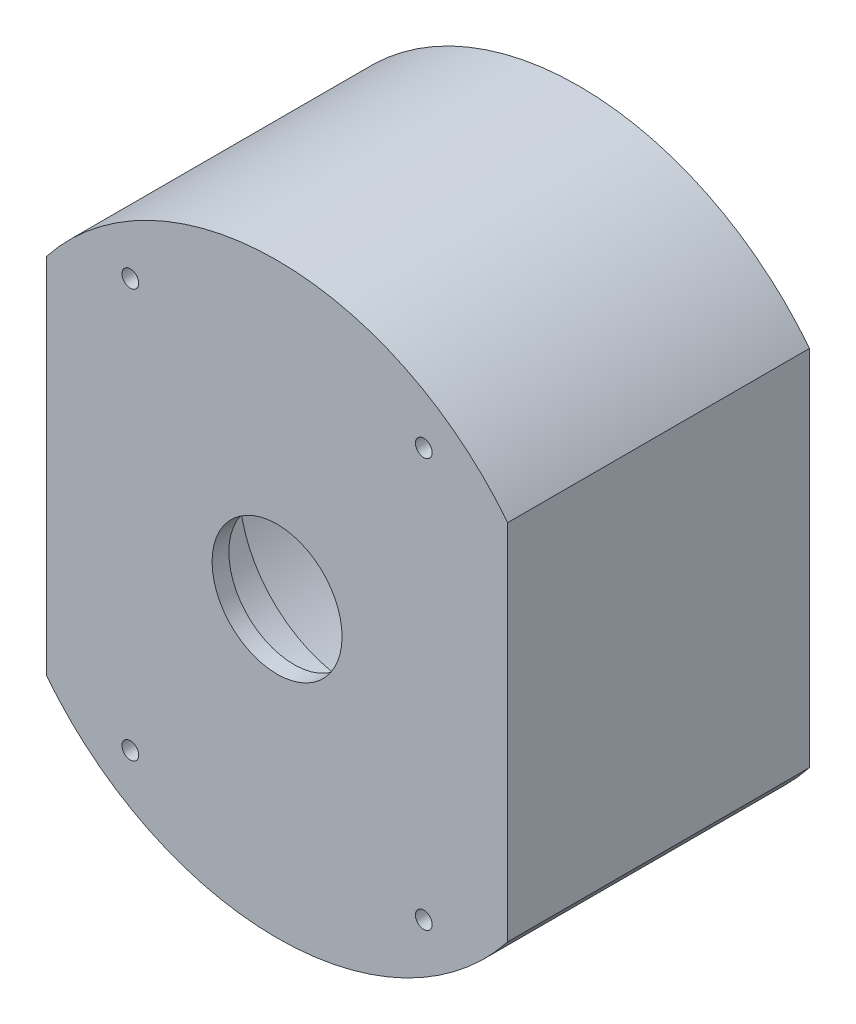
ISO-10303-21;
HEADER;
FILE_DESCRIPTION(('STEP AP214'),'2;1');
FILE_NAME('part.step','',(''),(''),'','','');
FILE_SCHEMA(('AUTOMOTIVE_DESIGN { 1 0 10303 214 1 1 1 1 }'));
ENDSEC;
DATA;
#1=APPLICATION_CONTEXT('core data for automotive mechanical design processes');
#2=APPLICATION_PROTOCOL_DEFINITION('international standard','automotive_design',2000,#1);
#3=PRODUCT_CONTEXT('',#1,'mechanical');
#4=PRODUCT('Part','Part','',(#3));
#5=PRODUCT_RELATED_PRODUCT_CATEGORY('part','',(#4));
#6=PRODUCT_DEFINITION_FORMATION('','',#4);
#7=PRODUCT_DEFINITION_CONTEXT('part definition',#1,'design');
#8=PRODUCT_DEFINITION('design','',#6,#7);
#9=PRODUCT_DEFINITION_SHAPE('','',#8);
#10=(LENGTH_UNIT() NAMED_UNIT(*) SI_UNIT(.MILLI.,.METRE.));
#11=(NAMED_UNIT(*) PLANE_ANGLE_UNIT() SI_UNIT($,.RADIAN.));
#12=(NAMED_UNIT(*) SI_UNIT($,.STERADIAN.) SOLID_ANGLE_UNIT());
#13=UNCERTAINTY_MEASURE_WITH_UNIT(LENGTH_MEASURE(1.E-05),#10,'distance_accuracy_value','');
#14=(GEOMETRIC_REPRESENTATION_CONTEXT(3) GLOBAL_UNCERTAINTY_ASSIGNED_CONTEXT((#13)) GLOBAL_UNIT_ASSIGNED_CONTEXT((#10,
#11,#12)) REPRESENTATION_CONTEXT('',''));
#15=CARTESIAN_POINT('',(0.,0.,0.));
#16=DIRECTION('',(0.,0.,1.));
#17=DIRECTION('',(1.,0.,0.));
#18=AXIS2_PLACEMENT_3D('',#15,#16,#17);
#19=CARTESIAN_POINT('',(0.,0.,72.));
#20=DIRECTION('',(0.,0.,-1.));
#21=DIRECTION('',(-1.,0.,0.));
#22=AXIS2_PLACEMENT_3D('',#19,#20,#21);
#23=CYLINDRICAL_SURFACE('',#22,15.5);
#24=CARTESIAN_POINT('',(0.,0.,72.));
#25=DIRECTION('',(0.,0.,1.));
#26=DIRECTION('',(1.,0.,0.));
#27=AXIS2_PLACEMENT_3D('',#24,#25,#26);
#28=CIRCLE('',#27,15.5);
#29=CARTESIAN_POINT('',(15.5,0.,72.));
#30=VERTEX_POINT('',#29);
#31=EDGE_CURVE('E96',#30,#30,#28,.T.);
#32=ORIENTED_EDGE('',*,*,#31,.T.);
#33=EDGE_LOOP('',(#32));
#34=FACE_BOUND('',#33,.T.);
#35=CARTESIAN_POINT('',(0.,0.,68.));
#36=DIRECTION('',(0.,0.,-1.));
#37=DIRECTION('',(-1.,0.,0.));
#38=AXIS2_PLACEMENT_3D('',#35,#36,#37);
#39=CIRCLE('',#38,15.5);
#40=CARTESIAN_POINT('',(-15.5,0.,68.));
#41=VERTEX_POINT('',#40);
#42=EDGE_CURVE('E37',#41,#41,#39,.T.);
#43=ORIENTED_EDGE('',*,*,#42,.T.);
#44=EDGE_LOOP('',(#43));
#45=FACE_BOUND('',#44,.T.);
#46=ADVANCED_FACE('F33',(#34,#45),#23,.F.);
#47=CARTESIAN_POINT('',(0.,0.,53.5));
#48=DIRECTION('',(0.,0.,-1.));
#49=DIRECTION('',(-1.,0.,0.));
#50=AXIS2_PLACEMENT_3D('',#47,#48,#49);
#51=CYLINDRICAL_SURFACE('',#50,50.25);
#52=CARTESIAN_POINT('',(0.,0.,0.));
#53=DIRECTION('',(0.,0.,1.));
#54=DIRECTION('',(1.,0.,0.));
#55=AXIS2_PLACEMENT_3D('',#52,#53,#54);
#56=CIRCLE('',#55,50.25);
#57=CARTESIAN_POINT('',(50.25,0.,0.));
#58=VERTEX_POINT('',#57);
#59=EDGE_CURVE('E118',#58,#58,#56,.T.);
#60=ORIENTED_EDGE('',*,*,#59,.F.);
#61=EDGE_LOOP('',(#60));
#62=FACE_BOUND('',#61,.T.);
#63=CARTESIAN_POINT('',(0.,0.,22.5));
#64=DIRECTION('',(0.,0.,1.));
#65=DIRECTION('',(1.,0.,0.));
#66=AXIS2_PLACEMENT_3D('',#63,#64,#65);
#67=CIRCLE('',#66,50.25);
#68=CARTESIAN_POINT('',(50.25,0.,22.5));
#69=VERTEX_POINT('',#68);
#70=EDGE_CURVE('E117',#69,#69,#67,.T.);
#71=ORIENTED_EDGE('',*,*,#70,.T.);
#72=EDGE_LOOP('',(#71));
#73=FACE_BOUND('',#72,.T.);
#74=ADVANCED_FACE('F133',(#62,#73),#51,.F.);
#75=CARTESIAN_POINT('',(0.,-5.89805981832114E-13,0.));
#76=DIRECTION('',(0.,0.,1.));
#77=DIRECTION('',(1.,0.,0.));
#78=AXIS2_PLACEMENT_3D('',#75,#76,#77);
#79=PLANE('',#78);
#80=CARTESIAN_POINT('',(-35.,48.7339717240448,0.));
#81=DIRECTION('',(0.,0.,1.));
#82=DIRECTION('',(1.,0.,0.));
#83=AXIS2_PLACEMENT_3D('',#80,#81,#82);
#84=CIRCLE('',#83,2.);
#85=CARTESIAN_POINT('',(-33.,48.7339717240448,0.));
#86=VERTEX_POINT('',#85);
#87=EDGE_CURVE('E193',#86,#86,#84,.T.);
#88=ORIENTED_EDGE('',*,*,#87,.T.);
#89=EDGE_LOOP('',(#88));
#90=FACE_BOUND('',#89,.T.);
#91=CARTESIAN_POINT('',(35.,48.7339717240448,0.));
#92=DIRECTION('',(0.,0.,1.));
#93=DIRECTION('',(1.,0.,0.));
#94=AXIS2_PLACEMENT_3D('',#91,#92,#93);
#95=CIRCLE('',#94,2.);
#96=CARTESIAN_POINT('',(37.,48.7339717240448,0.));
#97=VERTEX_POINT('',#96);
#98=EDGE_CURVE('E200',#97,#97,#95,.T.);
#99=ORIENTED_EDGE('',*,*,#98,.T.);
#100=EDGE_LOOP('',(#99));
#101=FACE_BOUND('',#100,.T.);
#102=CARTESIAN_POINT('',(35.,-48.7339717240448,0.));
#103=DIRECTION('',(0.,0.,1.));
#104=DIRECTION('',(1.,0.,0.));
#105=AXIS2_PLACEMENT_3D('',#102,#103,#104);
#106=CIRCLE('',#105,2.);
#107=CARTESIAN_POINT('',(37.,-48.7339717240448,0.));
#108=VERTEX_POINT('',#107);
#109=EDGE_CURVE('E206',#108,#108,#106,.T.);
#110=ORIENTED_EDGE('',*,*,#109,.T.);
#111=EDGE_LOOP('',(#110));
#112=FACE_BOUND('',#111,.T.);
#113=CARTESIAN_POINT('',(-35.,-48.7339717240448,0.));
#114=DIRECTION('',(0.,0.,1.));
#115=DIRECTION('',(1.,0.,0.));
#116=AXIS2_PLACEMENT_3D('',#113,#114,#115);
#117=CIRCLE('',#116,2.);
#118=CARTESIAN_POINT('',(-33.,-48.7339717240448,0.));
#119=VERTEX_POINT('',#118);
#120=EDGE_CURVE('E99',#119,#119,#117,.T.);
#121=ORIENTED_EDGE('',*,*,#120,.T.);
#122=EDGE_LOOP('',(#121));
#123=FACE_BOUND('',#122,.T.);
#124=CARTESIAN_POINT('',(0.,-5.89805981832114E-13,0.));
#125=DIRECTION('',(0.,0.,1.));
#126=DIRECTION('',(1.,0.,0.));
#127=AXIS2_PLACEMENT_3D('',#124,#125,#126);
#128=CIRCLE('',#127,70.0000000000004);
#129=CARTESIAN_POINT('',(55.,43.3012701892219,0.));
#130=VERTEX_POINT('',#129);
#131=CARTESIAN_POINT('',(-55.,43.3012701892219,0.));
#132=VERTEX_POINT('',#131);
#133=EDGE_CURVE('E81',#130,#132,#128,.T.);
#134=ORIENTED_EDGE('',*,*,#133,.F.);
#135=DIRECTION('',(0.,1.,0.));
#136=VECTOR('',#135,1.);
#137=CARTESIAN_POINT('',(55.,43.3012701892219,0.));
#138=LINE('',#137,#136);
#139=CARTESIAN_POINT('',(55.,-43.3012701892219,0.));
#140=VERTEX_POINT('',#139);
#141=EDGE_CURVE('E50',#140,#130,#138,.T.);
#142=ORIENTED_EDGE('',*,*,#141,.F.);
#143=CARTESIAN_POINT('',(0.,4.85722573273506E-13,0.));
#144=DIRECTION('',(0.,0.,1.));
#145=DIRECTION('',(-1.,0.,0.));
#146=AXIS2_PLACEMENT_3D('',#143,#144,#145);
#147=CIRCLE('',#146,70.0000000000003);
#148=CARTESIAN_POINT('',(-55.,-43.3012701892219,0.));
#149=VERTEX_POINT('',#148);
#150=EDGE_CURVE('E58',#149,#140,#147,.T.);
#151=ORIENTED_EDGE('',*,*,#150,.F.);
#152=DIRECTION('',(0.,-1.,0.));
#153=VECTOR('',#152,1.);
#154=CARTESIAN_POINT('',(-55.,43.3012701892219,0.));
#155=LINE('',#154,#153);
#156=EDGE_CURVE('E122',#132,#149,#155,.T.);
#157=ORIENTED_EDGE('',*,*,#156,.F.);
#158=EDGE_LOOP('',(#134,#142,#151,#157));
#159=FACE_BOUND('',#158,.T.);
#160=ORIENTED_EDGE('',*,*,#59,.T.);
#161=EDGE_LOOP('',(#160));
#162=FACE_BOUND('',#161,.T.);
#163=ADVANCED_FACE('F165',(#90,#101,#112,#123,#159,#162),#79,.F.);
#164=CARTESIAN_POINT('',(0.,-5.89805981832114E-13,53.5));
#165=DIRECTION('',(0.,0.,-1.));
#166=DIRECTION('',(-1.,0.,0.));
#167=AXIS2_PLACEMENT_3D('',#164,#165,#166);
#168=CYLINDRICAL_SURFACE('',#167,70.0000000000004);
#169=ORIENTED_EDGE('',*,*,#133,.T.);
#170=DIRECTION('',(0.,0.,-1.));
#171=VECTOR('',#170,1.);
#172=CARTESIAN_POINT('',(-55.,43.3012701892219,53.5));
#173=LINE('',#172,#171);
#174=CARTESIAN_POINT('',(-55.,43.3012701892219,72.));
#175=VERTEX_POINT('',#174);
#176=EDGE_CURVE('E11',#175,#132,#173,.T.);
#177=ORIENTED_EDGE('',*,*,#176,.F.);
#178=CARTESIAN_POINT('',(0.,-7.84095011141517E-13,72.));
#179=DIRECTION('',(0.,0.,1.));
#180=DIRECTION('',(-1.,0.,0.));
#181=AXIS2_PLACEMENT_3D('',#178,#179,#180);
#182=CIRCLE('',#181,70.0000000000005);
#183=CARTESIAN_POINT('',(55.,43.301270189222,72.));
#184=VERTEX_POINT('',#183);
#185=EDGE_CURVE('E79',#184,#175,#182,.T.);
#186=ORIENTED_EDGE('',*,*,#185,.F.);
#187=DIRECTION('',(0.,0.,-1.));
#188=VECTOR('',#187,1.);
#189=CARTESIAN_POINT('',(55.,43.3012701892219,53.5));
#190=LINE('',#189,#188);
#191=EDGE_CURVE('E126',#184,#130,#190,.T.);
#192=ORIENTED_EDGE('',*,*,#191,.T.);
#193=EDGE_LOOP('',(#169,#177,#186,#192));
#194=FACE_BOUND('',#193,.T.);
#195=ADVANCED_FACE('F35',(#194),#168,.T.);
#196=CARTESIAN_POINT('',(-55.,43.3012701892219,53.5));
#197=DIRECTION('',(1.,0.,0.));
#198=DIRECTION('',(0.,0.,-1.));
#199=AXIS2_PLACEMENT_3D('',#196,#197,#198);
#200=PLANE('',#199);
#201=ORIENTED_EDGE('',*,*,#156,.T.);
#202=DIRECTION('',(0.,0.,-1.));
#203=VECTOR('',#202,1.);
#204=CARTESIAN_POINT('',(-55.,-43.3012701892219,53.5));
#205=LINE('',#204,#203);
#206=CARTESIAN_POINT('',(-55.,-43.3012701892219,72.));
#207=VERTEX_POINT('',#206);
#208=EDGE_CURVE('E42',#207,#149,#205,.T.);
#209=ORIENTED_EDGE('',*,*,#208,.F.);
#210=DIRECTION('',(0.,-1.,0.));
#211=VECTOR('',#210,1.);
#212=CARTESIAN_POINT('',(-55.,43.3012701892219,72.));
#213=LINE('',#212,#211);
#214=EDGE_CURVE('E84',#175,#207,#213,.T.);
#215=ORIENTED_EDGE('',*,*,#214,.F.);
#216=ORIENTED_EDGE('',*,*,#176,.T.);
#217=EDGE_LOOP('',(#201,#209,#215,#216));
#218=FACE_BOUND('',#217,.T.);
#219=ADVANCED_FACE('F85',(#218),#200,.F.);
#220=CARTESIAN_POINT('',(0.,4.85722573273506E-13,53.5));
#221=DIRECTION('',(0.,0.,-1.));
#222=DIRECTION('',(-1.,0.,0.));
#223=AXIS2_PLACEMENT_3D('',#220,#221,#222);
#224=CYLINDRICAL_SURFACE('',#223,70.0000000000003);
#225=ORIENTED_EDGE('',*,*,#150,.T.);
#226=DIRECTION('',(0.,0.,-1.));
#227=VECTOR('',#226,1.);
#228=CARTESIAN_POINT('',(55.,-43.3012701892219,53.5));
#229=LINE('',#228,#227);
#230=CARTESIAN_POINT('',(55.,-43.3012701892219,72.));
#231=VERTEX_POINT('',#230);
#232=EDGE_CURVE('E128',#231,#140,#229,.T.);
#233=ORIENTED_EDGE('',*,*,#232,.F.);
#234=CARTESIAN_POINT('',(0.,7.97972798949331E-13,72.));
#235=DIRECTION('',(0.,0.,1.));
#236=DIRECTION('',(1.,0.,0.));
#237=AXIS2_PLACEMENT_3D('',#234,#235,#236);
#238=CIRCLE('',#237,70.0000000000005);
#239=EDGE_CURVE('E89',#207,#231,#238,.T.);
#240=ORIENTED_EDGE('',*,*,#239,.F.);
#241=ORIENTED_EDGE('',*,*,#208,.T.);
#242=EDGE_LOOP('',(#225,#233,#240,#241));
#243=FACE_BOUND('',#242,.T.);
#244=ADVANCED_FACE('F233',(#243),#224,.T.);
#245=CARTESIAN_POINT('',(55.,43.3012701892219,53.5));
#246=DIRECTION('',(-1.,0.,0.));
#247=DIRECTION('',(0.,0.,1.));
#248=AXIS2_PLACEMENT_3D('',#245,#246,#247);
#249=PLANE('',#248);
#250=ORIENTED_EDGE('',*,*,#141,.T.);
#251=ORIENTED_EDGE('',*,*,#191,.F.);
#252=DIRECTION('',(0.,1.,0.));
#253=VECTOR('',#252,1.);
#254=CARTESIAN_POINT('',(55.,43.301270189222,72.));
#255=LINE('',#254,#253);
#256=EDGE_CURVE('E95',#231,#184,#255,.T.);
#257=ORIENTED_EDGE('',*,*,#256,.F.);
#258=ORIENTED_EDGE('',*,*,#232,.T.);
#259=EDGE_LOOP('',(#250,#251,#257,#258));
#260=FACE_BOUND('',#259,.T.);
#261=ADVANCED_FACE('F145',(#260),#249,.F.);
#262=CARTESIAN_POINT('',(0.,0.,22.5));
#263=DIRECTION('',(0.,0.,1.));
#264=DIRECTION('',(1.,0.,0.));
#265=AXIS2_PLACEMENT_3D('',#262,#263,#264);
#266=CYLINDRICAL_SURFACE('',#265,50.5);
#267=CARTESIAN_POINT('',(0.,0.,22.5));
#268=DIRECTION('',(0.,0.,1.));
#269=DIRECTION('',(1.,0.,0.));
#270=AXIS2_PLACEMENT_3D('',#267,#268,#269);
#271=CIRCLE('',#270,50.5);
#272=CARTESIAN_POINT('',(50.5,0.,22.5));
#273=VERTEX_POINT('',#272);
#274=EDGE_CURVE('E114',#273,#273,#271,.T.);
#275=ORIENTED_EDGE('',*,*,#274,.F.);
#276=EDGE_LOOP('',(#275));
#277=FACE_BOUND('',#276,.T.);
#278=CARTESIAN_POINT('',(0.,0.,53.5));
#279=DIRECTION('',(0.,0.,1.));
#280=DIRECTION('',(1.,0.,0.));
#281=AXIS2_PLACEMENT_3D('',#278,#279,#280);
#282=CIRCLE('',#281,50.5);
#283=CARTESIAN_POINT('',(50.5,0.,53.5));
#284=VERTEX_POINT('',#283);
#285=EDGE_CURVE('E111',#284,#284,#282,.F.);
#286=ORIENTED_EDGE('',*,*,#285,.F.);
#287=EDGE_LOOP('',(#286));
#288=FACE_BOUND('',#287,.T.);
#289=ADVANCED_FACE('F139',(#277,#288),#266,.F.);
#290=CARTESIAN_POINT('',(0.,0.,22.5));
#291=DIRECTION('',(0.,0.,1.));
#292=DIRECTION('',(1.,0.,0.));
#293=AXIS2_PLACEMENT_3D('',#290,#291,#292);
#294=PLANE('',#293);
#295=ORIENTED_EDGE('',*,*,#70,.F.);
#296=EDGE_LOOP('',(#295));
#297=FACE_BOUND('',#296,.T.);
#298=ORIENTED_EDGE('',*,*,#274,.T.);
#299=EDGE_LOOP('',(#298));
#300=FACE_BOUND('',#299,.T.);
#301=ADVANCED_FACE('F135',(#297,#300),#294,.T.);
#302=CARTESIAN_POINT('',(0.,6.80011602582908E-13,53.5));
#303=DIRECTION('',(0.,0.,1.));
#304=DIRECTION('',(1.,0.,0.));
#305=AXIS2_PLACEMENT_3D('',#302,#303,#304);
#306=PLANE('',#305);
#307=CARTESIAN_POINT('',(0.,0.,53.5));
#308=DIRECTION('',(0.,0.,1.));
#309=DIRECTION('',(1.,0.,0.));
#310=AXIS2_PLACEMENT_3D('',#307,#308,#309);
#311=CIRCLE('',#310,27.5);
#312=CARTESIAN_POINT('',(27.5,0.,53.5));
#313=VERTEX_POINT('',#312);
#314=EDGE_CURVE('E108',#313,#313,#311,.T.);
#315=ORIENTED_EDGE('',*,*,#314,.T.);
#316=EDGE_LOOP('',(#315));
#317=FACE_BOUND('',#316,.T.);
#318=ORIENTED_EDGE('',*,*,#285,.T.);
#319=EDGE_LOOP('',(#318));
#320=FACE_BOUND('',#319,.T.);
#321=ADVANCED_FACE('F138',(#317,#320),#306,.F.);
#322=CARTESIAN_POINT('',(0.,0.,67.));
#323=DIRECTION('',(0.,0.,-1.));
#324=DIRECTION('',(-1.,0.,0.));
#325=AXIS2_PLACEMENT_3D('',#322,#323,#324);
#326=CYLINDRICAL_SURFACE('',#325,27.5);
#327=CARTESIAN_POINT('',(0.,0.,67.));
#328=DIRECTION('',(0.,0.,-1.));
#329=DIRECTION('',(-1.,0.,0.));
#330=AXIS2_PLACEMENT_3D('',#327,#328,#329);
#331=CIRCLE('',#330,27.5);
#332=CARTESIAN_POINT('',(-27.5,0.,67.));
#333=VERTEX_POINT('',#332);
#334=EDGE_CURVE('E105',#333,#333,#331,.T.);
#335=ORIENTED_EDGE('',*,*,#334,.F.);
#336=EDGE_LOOP('',(#335));
#337=FACE_BOUND('',#336,.T.);
#338=ORIENTED_EDGE('',*,*,#314,.F.);
#339=EDGE_LOOP('',(#338));
#340=FACE_BOUND('',#339,.T.);
#341=ADVANCED_FACE('F150',(#337,#340),#326,.F.);
#342=CARTESIAN_POINT('',(0.,-7.84095011141517E-13,67.));
#343=DIRECTION('',(0.,0.,-1.));
#344=DIRECTION('',(-1.,0.,0.));
#345=AXIS2_PLACEMENT_3D('',#342,#343,#344);
#346=PLANE('',#345);
#347=CARTESIAN_POINT('',(0.,0.,67.));
#348=DIRECTION('',(0.,0.,-1.));
#349=DIRECTION('',(-1.,0.,0.));
#350=AXIS2_PLACEMENT_3D('',#347,#348,#349);
#351=CIRCLE('',#350,22.5);
#352=CARTESIAN_POINT('',(-22.5,0.,67.));
#353=VERTEX_POINT('',#352);
#354=EDGE_CURVE('E183',#353,#353,#351,.T.);
#355=ORIENTED_EDGE('',*,*,#354,.F.);
#356=EDGE_LOOP('',(#355));
#357=FACE_BOUND('',#356,.T.);
#358=ORIENTED_EDGE('',*,*,#334,.T.);
#359=EDGE_LOOP('',(#358));
#360=FACE_BOUND('',#359,.T.);
#361=ADVANCED_FACE('F156',(#357,#360),#346,.T.);
#362=CARTESIAN_POINT('',(0.,-7.84095011141517E-13,72.));
#363=DIRECTION('',(0.,0.,-1.));
#364=DIRECTION('',(-1.,0.,0.));
#365=AXIS2_PLACEMENT_3D('',#362,#363,#364);
#366=PLANE('',#365);
#367=CARTESIAN_POINT('',(-35.,48.7339717240448,72.));
#368=DIRECTION('',(0.,0.,1.));
#369=DIRECTION('',(1.,0.,0.));
#370=AXIS2_PLACEMENT_3D('',#367,#368,#369);
#371=CIRCLE('',#370,2.);
#372=CARTESIAN_POINT('',(-33.,48.7339717240448,72.));
#373=VERTEX_POINT('',#372);
#374=EDGE_CURVE('E197',#373,#373,#371,.T.);
#375=ORIENTED_EDGE('',*,*,#374,.F.);
#376=EDGE_LOOP('',(#375));
#377=FACE_BOUND('',#376,.T.);
#378=CARTESIAN_POINT('',(35.,48.7339717240448,72.));
#379=DIRECTION('',(0.,0.,1.));
#380=DIRECTION('',(1.,0.,0.));
#381=AXIS2_PLACEMENT_3D('',#378,#379,#380);
#382=CIRCLE('',#381,2.);
#383=CARTESIAN_POINT('',(37.,48.7339717240448,72.));
#384=VERTEX_POINT('',#383);
#385=EDGE_CURVE('E203',#384,#384,#382,.T.);
#386=ORIENTED_EDGE('',*,*,#385,.F.);
#387=EDGE_LOOP('',(#386));
#388=FACE_BOUND('',#387,.T.);
#389=CARTESIAN_POINT('',(35.,-48.7339717240448,72.));
#390=DIRECTION('',(0.,0.,1.));
#391=DIRECTION('',(1.,0.,0.));
#392=AXIS2_PLACEMENT_3D('',#389,#390,#391);
#393=CIRCLE('',#392,2.);
#394=CARTESIAN_POINT('',(37.,-48.7339717240448,72.));
#395=VERTEX_POINT('',#394);
#396=EDGE_CURVE('E209',#395,#395,#393,.T.);
#397=ORIENTED_EDGE('',*,*,#396,.F.);
#398=EDGE_LOOP('',(#397));
#399=FACE_BOUND('',#398,.T.);
#400=CARTESIAN_POINT('',(-35.,-48.7339717240448,72.));
#401=DIRECTION('',(0.,0.,1.));
#402=DIRECTION('',(1.,0.,0.));
#403=AXIS2_PLACEMENT_3D('',#400,#401,#402);
#404=CIRCLE('',#403,2.);
#405=CARTESIAN_POINT('',(-33.,-48.7339717240448,72.));
#406=VERTEX_POINT('',#405);
#407=EDGE_CURVE('E196',#406,#406,#404,.T.);
#408=ORIENTED_EDGE('',*,*,#407,.F.);
#409=EDGE_LOOP('',(#408));
#410=FACE_BOUND('',#409,.T.);
#411=ORIENTED_EDGE('',*,*,#185,.T.);
#412=ORIENTED_EDGE('',*,*,#214,.T.);
#413=ORIENTED_EDGE('',*,*,#239,.T.);
#414=ORIENTED_EDGE('',*,*,#256,.T.);
#415=EDGE_LOOP('',(#411,#412,#413,#414));
#416=FACE_BOUND('',#415,.T.);
#417=ORIENTED_EDGE('',*,*,#31,.F.);
#418=EDGE_LOOP('',(#417));
#419=FACE_BOUND('',#418,.T.);
#420=ADVANCED_FACE('F92',(#377,#388,#399,#410,#416,#419),#366,.F.);
#421=CARTESIAN_POINT('',(-35.,-48.7339717240448,0.));
#422=DIRECTION('',(0.,0.,1.));
#423=DIRECTION('',(1.,0.,0.));
#424=AXIS2_PLACEMENT_3D('',#421,#422,#423);
#425=CYLINDRICAL_SURFACE('',#424,2.);
#426=ORIENTED_EDGE('',*,*,#120,.F.);
#427=EDGE_LOOP('',(#426));
#428=FACE_BOUND('',#427,.T.);
#429=ORIENTED_EDGE('',*,*,#407,.T.);
#430=EDGE_LOOP('',(#429));
#431=FACE_BOUND('',#430,.T.);
#432=ADVANCED_FACE('F171',(#428,#431),#425,.F.);
#433=CARTESIAN_POINT('',(35.,-48.7339717240448,0.));
#434=DIRECTION('',(0.,0.,1.));
#435=DIRECTION('',(1.,0.,0.));
#436=AXIS2_PLACEMENT_3D('',#433,#434,#435);
#437=CYLINDRICAL_SURFACE('',#436,2.);
#438=ORIENTED_EDGE('',*,*,#109,.F.);
#439=EDGE_LOOP('',(#438));
#440=FACE_BOUND('',#439,.T.);
#441=ORIENTED_EDGE('',*,*,#396,.T.);
#442=EDGE_LOOP('',(#441));
#443=FACE_BOUND('',#442,.T.);
#444=ADVANCED_FACE('F218',(#440,#443),#437,.F.);
#445=CARTESIAN_POINT('',(35.,48.7339717240448,0.));
#446=DIRECTION('',(0.,0.,1.));
#447=DIRECTION('',(1.,0.,0.));
#448=AXIS2_PLACEMENT_3D('',#445,#446,#447);
#449=CYLINDRICAL_SURFACE('',#448,2.);
#450=ORIENTED_EDGE('',*,*,#98,.F.);
#451=EDGE_LOOP('',(#450));
#452=FACE_BOUND('',#451,.T.);
#453=ORIENTED_EDGE('',*,*,#385,.T.);
#454=EDGE_LOOP('',(#453));
#455=FACE_BOUND('',#454,.T.);
#456=ADVANCED_FACE('F223',(#452,#455),#449,.F.);
#457=CARTESIAN_POINT('',(-35.,48.7339717240448,0.));
#458=DIRECTION('',(0.,0.,1.));
#459=DIRECTION('',(1.,0.,0.));
#460=AXIS2_PLACEMENT_3D('',#457,#458,#459);
#461=CYLINDRICAL_SURFACE('',#460,2.);
#462=ORIENTED_EDGE('',*,*,#87,.F.);
#463=EDGE_LOOP('',(#462));
#464=FACE_BOUND('',#463,.T.);
#465=ORIENTED_EDGE('',*,*,#374,.T.);
#466=EDGE_LOOP('',(#465));
#467=FACE_BOUND('',#466,.T.);
#468=ADVANCED_FACE('F336',(#464,#467),#461,.F.);
#469=CARTESIAN_POINT('',(0.,0.,68.));
#470=DIRECTION('',(0.,0.,-1.));
#471=DIRECTION('',(-1.,0.,0.));
#472=AXIS2_PLACEMENT_3D('',#469,#470,#471);
#473=CYLINDRICAL_SURFACE('',#472,22.5);
#474=CARTESIAN_POINT('',(0.,0.,68.));
#475=DIRECTION('',(0.,0.,-1.));
#476=DIRECTION('',(-1.,0.,0.));
#477=AXIS2_PLACEMENT_3D('',#474,#475,#476);
#478=CIRCLE('',#477,22.5);
#479=CARTESIAN_POINT('',(-22.5,0.,68.));
#480=VERTEX_POINT('',#479);
#481=EDGE_CURVE('E188',#480,#480,#478,.T.);
#482=ORIENTED_EDGE('',*,*,#481,.F.);
#483=EDGE_LOOP('',(#482));
#484=FACE_BOUND('',#483,.T.);
#485=ORIENTED_EDGE('',*,*,#354,.T.);
#486=EDGE_LOOP('',(#485));
#487=FACE_BOUND('',#486,.T.);
#488=ADVANCED_FACE('F345',(#484,#487),#473,.F.);
#489=CARTESIAN_POINT('',(0.,0.,68.));
#490=DIRECTION('',(0.,0.,-1.));
#491=DIRECTION('',(-1.,0.,0.));
#492=AXIS2_PLACEMENT_3D('',#489,#490,#491);
#493=PLANE('',#492);
#494=ORIENTED_EDGE('',*,*,#42,.F.);
#495=EDGE_LOOP('',(#494));
#496=FACE_BOUND('',#495,.T.);
#497=ORIENTED_EDGE('',*,*,#481,.T.);
#498=EDGE_LOOP('',(#497));
#499=FACE_BOUND('',#498,.T.);
#500=ADVANCED_FACE('F357',(#496,#499),#493,.T.);
#501=CLOSED_SHELL('',(#46,#74,#163,#195,#219,#244,#261,#289,#301,#321,#341,#361,#420,#432,#444,
#456,#468,#488,#500));
#502=MANIFOLD_SOLID_BREP('B2',#501);
#503=ADVANCED_BREP_SHAPE_REPRESENTATION('',(#18,#502),#14);
#504=SHAPE_DEFINITION_REPRESENTATION(#9,#503);
ENDSEC;
END-ISO-10303-21;
